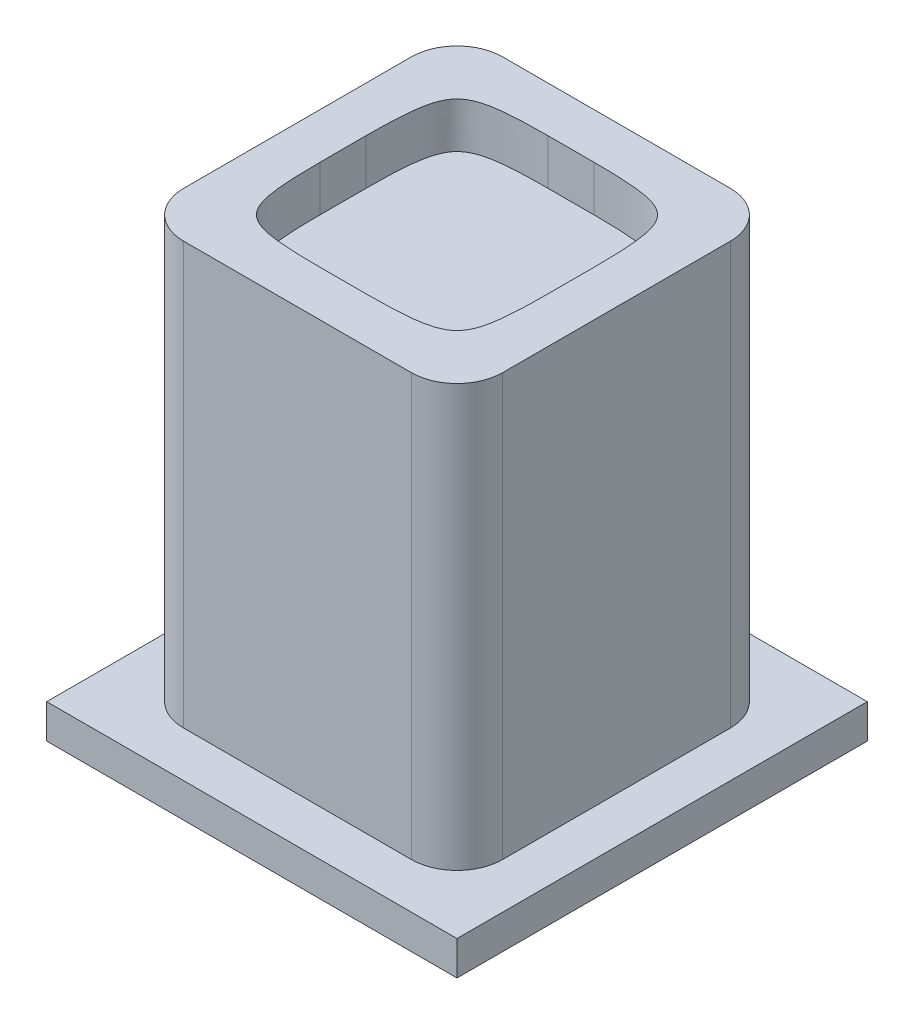
ISO-10303-21;
HEADER;
FILE_DESCRIPTION(('STEP AP214'),'2;1');
FILE_NAME('part.step','',(''),(''),'','','');
FILE_SCHEMA(('AUTOMOTIVE_DESIGN { 1 0 10303 214 1 1 1 1 }'));
ENDSEC;
DATA;
#1=APPLICATION_CONTEXT('core data for automotive mechanical design processes');
#2=APPLICATION_PROTOCOL_DEFINITION('international standard','automotive_design',2000,#1);
#3=PRODUCT_CONTEXT('',#1,'mechanical');
#4=PRODUCT('Part','Part','',(#3));
#5=PRODUCT_RELATED_PRODUCT_CATEGORY('part','',(#4));
#6=PRODUCT_DEFINITION_FORMATION('','',#4);
#7=PRODUCT_DEFINITION_CONTEXT('part definition',#1,'design');
#8=PRODUCT_DEFINITION('design','',#6,#7);
#9=PRODUCT_DEFINITION_SHAPE('','',#8);
#10=(LENGTH_UNIT() NAMED_UNIT(*) SI_UNIT(.MILLI.,.METRE.));
#11=(NAMED_UNIT(*) PLANE_ANGLE_UNIT() SI_UNIT($,.RADIAN.));
#12=(NAMED_UNIT(*) SI_UNIT($,.STERADIAN.) SOLID_ANGLE_UNIT());
#13=UNCERTAINTY_MEASURE_WITH_UNIT(LENGTH_MEASURE(1.E-05),#10,'distance_accuracy_value','');
#14=(GEOMETRIC_REPRESENTATION_CONTEXT(3) GLOBAL_UNCERTAINTY_ASSIGNED_CONTEXT((#13)) GLOBAL_UNIT_ASSIGNED_CONTEXT((#10,
#11,#12)) REPRESENTATION_CONTEXT('',''));
#15=CARTESIAN_POINT('',(0.,0.,0.));
#16=DIRECTION('',(0.,0.,1.));
#17=DIRECTION('',(1.,0.,0.));
#18=AXIS2_PLACEMENT_3D('',#15,#16,#17);
#19=CARTESIAN_POINT('',(0.,10.,-20.1661767732471));
#20=DIRECTION('',(0.,0.,-1.));
#21=DIRECTION('',(-1.,0.,0.));
#22=AXIS2_PLACEMENT_3D('',#19,#20,#21);
#23=PLANE('',#22);
#24=DIRECTION('',(1.,0.,0.));
#25=VECTOR('',#24,1.);
#26=CARTESIAN_POINT('',(-6.71300020580802,0.75,-20.1661767732471));
#27=LINE('',#26,#25);
#28=CARTESIAN_POINT('',(-12.713000205808,0.75,-20.1661767732471));
#29=VERTEX_POINT('',#28);
#30=CARTESIAN_POINT('',(-7.71300020580801,0.75,-20.1661767732471));
#31=VERTEX_POINT('',#30);
#32=EDGE_CURVE('E198',#29,#31,#27,.T.);
#33=ORIENTED_EDGE('',*,*,#32,.F.);
#34=DIRECTION('',(0.,-1.,0.));
#35=VECTOR('',#34,1.);
#36=CARTESIAN_POINT('',(-12.713000205808,10.,-20.1661767732471));
#37=LINE('',#36,#35);
#38=CARTESIAN_POINT('',(-12.713000205808,10.,-20.1661767732471));
#39=VERTEX_POINT('',#38);
#40=EDGE_CURVE('E706',#29,#39,#37,.F.);
#41=ORIENTED_EDGE('',*,*,#40,.T.);
#42=DIRECTION('',(1.,0.,0.));
#43=VECTOR('',#42,1.);
#44=CARTESIAN_POINT('',(0.,10.,-20.1661767732471));
#45=LINE('',#44,#43);
#46=CARTESIAN_POINT('',(-7.71300020580801,10.,-20.1661767732471));
#47=VERTEX_POINT('',#46);
#48=EDGE_CURVE('E244',#39,#47,#45,.T.);
#49=ORIENTED_EDGE('',*,*,#48,.T.);
#50=DIRECTION('',(0.,-1.,0.));
#51=VECTOR('',#50,1.);
#52=CARTESIAN_POINT('',(-7.71300020580801,10.,-20.1661767732471));
#53=LINE('',#52,#51);
#54=EDGE_CURVE('E718',#47,#31,#53,.T.);
#55=ORIENTED_EDGE('',*,*,#54,.T.);
#56=EDGE_LOOP('',(#33,#41,#49,#55));
#57=FACE_BOUND('',#56,.T.);
#58=ADVANCED_FACE('F41',(#57),#23,.T.);
#59=CARTESIAN_POINT('',(-13.713000205808,10.,0.));
#60=DIRECTION('',(1.,0.,0.));
#61=DIRECTION('',(0.,0.,-1.));
#62=AXIS2_PLACEMENT_3D('',#59,#60,#61);
#63=PLANE('',#62);
#64=DIRECTION('',(0.,0.,-1.));
#65=VECTOR('',#64,1.);
#66=CARTESIAN_POINT('',(-13.713000205808,0.75,-20.1661767732471));
#67=LINE('',#66,#65);
#68=CARTESIAN_POINT('',(-13.713000205808,0.75,-14.1661767732471));
#69=VERTEX_POINT('',#68);
#70=CARTESIAN_POINT('',(-13.713000205808,0.75,-19.1661767732471));
#71=VERTEX_POINT('',#70);
#72=EDGE_CURVE('E205',#69,#71,#67,.T.);
#73=ORIENTED_EDGE('',*,*,#72,.F.);
#74=DIRECTION('',(0.,-1.,0.));
#75=VECTOR('',#74,1.);
#76=CARTESIAN_POINT('',(-13.713000205808,10.,-14.1661767732471));
#77=LINE('',#76,#75);
#78=CARTESIAN_POINT('',(-13.713000205808,10.,-14.1661767732471));
#79=VERTEX_POINT('',#78);
#80=EDGE_CURVE('E730',#69,#79,#77,.F.);
#81=ORIENTED_EDGE('',*,*,#80,.T.);
#82=DIRECTION('',(0.,0.,1.));
#83=VECTOR('',#82,1.);
#84=CARTESIAN_POINT('',(-13.713000205808,10.,0.));
#85=LINE('',#84,#83);
#86=CARTESIAN_POINT('',(-13.713000205808,10.,-19.1661767732471));
#87=VERTEX_POINT('',#86);
#88=EDGE_CURVE('E247',#87,#79,#85,.T.);
#89=ORIENTED_EDGE('',*,*,#88,.F.);
#90=DIRECTION('',(0.,-1.,0.));
#91=VECTOR('',#90,1.);
#92=CARTESIAN_POINT('',(-13.713000205808,0.750000000000001,-19.1661767732471));
#93=LINE('',#92,#91);
#94=EDGE_CURVE('E732',#87,#71,#93,.T.);
#95=ORIENTED_EDGE('',*,*,#94,.T.);
#96=EDGE_LOOP('',(#73,#81,#89,#95));
#97=FACE_BOUND('',#96,.T.);
#98=ADVANCED_FACE('F676',(#97),#63,.F.);
#99=CARTESIAN_POINT('',(0.,10.,-13.1661767732471));
#100=DIRECTION('',(0.,0.,-1.));
#101=DIRECTION('',(-1.,0.,0.));
#102=AXIS2_PLACEMENT_3D('',#99,#100,#101);
#103=PLANE('',#102);
#104=DIRECTION('',(1.,0.,0.));
#105=VECTOR('',#104,1.);
#106=CARTESIAN_POINT('',(0.,10.,-13.1661767732471));
#107=LINE('',#106,#105);
#108=CARTESIAN_POINT('',(-12.713000205808,10.,-13.1661767732471));
#109=VERTEX_POINT('',#108);
#110=CARTESIAN_POINT('',(-7.71300020580801,10.,-13.1661767732471));
#111=VERTEX_POINT('',#110);
#112=EDGE_CURVE('E232',#109,#111,#107,.T.);
#113=ORIENTED_EDGE('',*,*,#112,.F.);
#114=DIRECTION('',(0.,-1.,0.));
#115=VECTOR('',#114,1.);
#116=CARTESIAN_POINT('',(-12.713000205808,10.,-13.1661767732471));
#117=LINE('',#116,#115);
#118=CARTESIAN_POINT('',(-12.713000205808,0.75,-13.166176773247));
#119=VERTEX_POINT('',#118);
#120=EDGE_CURVE('E733',#109,#119,#117,.T.);
#121=ORIENTED_EDGE('',*,*,#120,.T.);
#122=DIRECTION('',(-1.,0.,0.));
#123=VECTOR('',#122,1.);
#124=CARTESIAN_POINT('',(-13.713000205808,0.75,-13.166176773247));
#125=LINE('',#124,#123);
#126=CARTESIAN_POINT('',(-7.71300020580801,0.75,-13.1661767732471));
#127=VERTEX_POINT('',#126);
#128=EDGE_CURVE('E206',#127,#119,#125,.T.);
#129=ORIENTED_EDGE('',*,*,#128,.F.);
#130=DIRECTION('',(0.,-1.,0.));
#131=VECTOR('',#130,1.);
#132=CARTESIAN_POINT('',(-7.71300020580801,10.,-13.1661767732471));
#133=LINE('',#132,#131);
#134=EDGE_CURVE('E459',#127,#111,#133,.F.);
#135=ORIENTED_EDGE('',*,*,#134,.T.);
#136=EDGE_LOOP('',(#113,#121,#129,#135));
#137=FACE_BOUND('',#136,.T.);
#138=ADVANCED_FACE('F682',(#137),#103,.F.);
#139=CARTESIAN_POINT('',(-6.71300020580801,10.,0.));
#140=DIRECTION('',(1.,0.,0.));
#141=DIRECTION('',(0.,0.,-1.));
#142=AXIS2_PLACEMENT_3D('',#139,#140,#141);
#143=PLANE('',#142);
#144=DIRECTION('',(0.,0.,1.));
#145=VECTOR('',#144,1.);
#146=CARTESIAN_POINT('',(-6.71300020580801,0.75,-13.1661767732471));
#147=LINE('',#146,#145);
#148=CARTESIAN_POINT('',(-6.71300020580801,0.75,-19.1661767732471));
#149=VERTEX_POINT('',#148);
#150=CARTESIAN_POINT('',(-6.71300020580801,0.75,-14.1661767732471));
#151=VERTEX_POINT('',#150);
#152=EDGE_CURVE('E229',#149,#151,#147,.T.);
#153=ORIENTED_EDGE('',*,*,#152,.F.);
#154=DIRECTION('',(0.,-1.,0.));
#155=VECTOR('',#154,1.);
#156=CARTESIAN_POINT('',(-6.71300020580801,10.,-19.1661767732471));
#157=LINE('',#156,#155);
#158=CARTESIAN_POINT('',(-6.71300020580801,10.,-19.1661767732471));
#159=VERTEX_POINT('',#158);
#160=EDGE_CURVE('E693',#149,#159,#157,.F.);
#161=ORIENTED_EDGE('',*,*,#160,.T.);
#162=DIRECTION('',(0.,0.,1.));
#163=VECTOR('',#162,1.);
#164=CARTESIAN_POINT('',(-6.71300020580801,10.,0.));
#165=LINE('',#164,#163);
#166=CARTESIAN_POINT('',(-6.71300020580801,10.,-14.1661767732471));
#167=VERTEX_POINT('',#166);
#168=EDGE_CURVE('E239',#159,#167,#165,.T.);
#169=ORIENTED_EDGE('',*,*,#168,.T.);
#170=DIRECTION('',(0.,-1.,0.));
#171=VECTOR('',#170,1.);
#172=CARTESIAN_POINT('',(-6.71300020580801,0.750000000000001,-14.1661767732471));
#173=LINE('',#172,#171);
#174=EDGE_CURVE('E695',#167,#151,#173,.T.);
#175=ORIENTED_EDGE('',*,*,#174,.T.);
#176=EDGE_LOOP('',(#153,#161,#169,#175));
#177=FACE_BOUND('',#176,.T.);
#178=ADVANCED_FACE('F426',(#177),#143,.T.);
#179=CARTESIAN_POINT('',(0.,10.,0.));
#180=DIRECTION('',(0.,1.,0.));
#181=DIRECTION('',(0.,0.,1.));
#182=AXIS2_PLACEMENT_3D('',#179,#180,#181);
#183=PLANE('',#182);
#184=DIRECTION('',(0.,0.,-1.));
#185=VECTOR('',#184,1.);
#186=CARTESIAN_POINT('',(-7.71300020580801,10.,-14.1661767732471));
#187=LINE('',#186,#185);
#188=CARTESIAN_POINT('',(-7.71300020580801,10.,-16.1661767732471));
#189=VERTEX_POINT('',#188);
#190=CARTESIAN_POINT('',(-7.71300020580801,10.,-17.1661767732471));
#191=VERTEX_POINT('',#190);
#192=EDGE_CURVE('E270',#189,#191,#187,.T.);
#193=ORIENTED_EDGE('',*,*,#192,.F.);
#194=CARTESIAN_POINT('',(-9.71300020580801,10.,-14.1661767732471));
#195=CARTESIAN_POINT('',(-7.71300020580801,10.,-14.1661767732471));
#196=CARTESIAN_POINT('',(-7.71300020580801,10.,-16.1661767732471));
#197=(BOUNDED_CURVE() B_SPLINE_CURVE(2,(#194,#195,#196),.UNSPECIFIED.,.F.,
.F.) B_SPLINE_CURVE_WITH_KNOTS((3,3),(0.,1.),
.UNSPECIFIED.) CURVE() GEOMETRIC_REPRESENTATION_ITEM() RATIONAL_B_SPLINE_CURVE((1.,
2.33333333333334,1.)) REPRESENTATION_ITEM(''));
#198=CARTESIAN_POINT('',(-9.71300020580801,10.,-14.1661767732471));
#199=VERTEX_POINT('',#198);
#200=EDGE_CURVE('E455',#189,#199,#197,.F.);
#201=ORIENTED_EDGE('',*,*,#200,.T.);
#202=DIRECTION('',(1.,0.,0.));
#203=VECTOR('',#202,1.);
#204=CARTESIAN_POINT('',(-7.71300020580801,10.,-14.1661767732471));
#205=LINE('',#204,#203);
#206=CARTESIAN_POINT('',(-10.713000205808,10.,-14.1661767732471));
#207=VERTEX_POINT('',#206);
#208=EDGE_CURVE('E255',#207,#199,#205,.T.);
#209=ORIENTED_EDGE('',*,*,#208,.F.);
#210=CARTESIAN_POINT('',(-12.713000205808,10.,-16.1661767732471));
#211=CARTESIAN_POINT('',(-12.713000205808,10.,-14.1661767732471));
#212=CARTESIAN_POINT('',(-10.713000205808,10.,-14.1661767732471));
#213=(BOUNDED_CURVE() B_SPLINE_CURVE(2,(#210,#211,#212),.UNSPECIFIED.,.F.,
.F.) B_SPLINE_CURVE_WITH_KNOTS((3,3),(0.,1.),
.UNSPECIFIED.) CURVE() GEOMETRIC_REPRESENTATION_ITEM() RATIONAL_B_SPLINE_CURVE((1.,
2.33333333333334,1.)) REPRESENTATION_ITEM(''));
#214=CARTESIAN_POINT('',(-12.713000205808,10.,-16.1661767732471));
#215=VERTEX_POINT('',#214);
#216=EDGE_CURVE('E447',#207,#215,#213,.F.);
#217=ORIENTED_EDGE('',*,*,#216,.T.);
#218=DIRECTION('',(0.,0.,1.));
#219=VECTOR('',#218,1.);
#220=CARTESIAN_POINT('',(-12.713000205808,10.,-14.1661767732471));
#221=LINE('',#220,#219);
#222=CARTESIAN_POINT('',(-12.713000205808,10.,-17.1661767732471));
#223=VERTEX_POINT('',#222);
#224=EDGE_CURVE('E252',#223,#215,#221,.T.);
#225=ORIENTED_EDGE('',*,*,#224,.F.);
#226=CARTESIAN_POINT('',(-10.713000205808,10.,-19.1661767732471));
#227=CARTESIAN_POINT('',(-12.713000205808,10.,-19.1661767732471));
#228=CARTESIAN_POINT('',(-12.713000205808,10.,-17.1661767732471));
#229=(BOUNDED_CURVE() B_SPLINE_CURVE(2,(#226,#227,#228),.UNSPECIFIED.,.F.,
.F.) B_SPLINE_CURVE_WITH_KNOTS((3,3),(0.,1.),
.UNSPECIFIED.) CURVE() GEOMETRIC_REPRESENTATION_ITEM() RATIONAL_B_SPLINE_CURVE((1.,
2.33333333333334,1.)) REPRESENTATION_ITEM(''));
#230=CARTESIAN_POINT('',(-10.713000205808,10.,-19.1661767732471));
#231=VERTEX_POINT('',#230);
#232=EDGE_CURVE('E410',#223,#231,#229,.F.);
#233=ORIENTED_EDGE('',*,*,#232,.T.);
#234=DIRECTION('',(-1.,0.,0.));
#235=VECTOR('',#234,1.);
#236=CARTESIAN_POINT('',(-7.71300020580801,10.,-19.1661767732471));
#237=LINE('',#236,#235);
#238=CARTESIAN_POINT('',(-9.71300020580801,10.,-19.1661767732471));
#239=VERTEX_POINT('',#238);
#240=EDGE_CURVE('E256',#239,#231,#237,.T.);
#241=ORIENTED_EDGE('',*,*,#240,.F.);
#242=CARTESIAN_POINT('',(-7.71300020580802,10.,-17.1661767732471));
#243=CARTESIAN_POINT('',(-7.71300020580801,10.,-19.1661767732471));
#244=CARTESIAN_POINT('',(-9.71300020580801,10.,-19.1661767732471));
#245=(BOUNDED_CURVE() B_SPLINE_CURVE(2,(#242,#243,#244),.UNSPECIFIED.,.F.,
.F.) B_SPLINE_CURVE_WITH_KNOTS((3,3),(0.,1.),
.UNSPECIFIED.) CURVE() GEOMETRIC_REPRESENTATION_ITEM() RATIONAL_B_SPLINE_CURVE((1.,
2.33333333333334,1.)) REPRESENTATION_ITEM(''));
#246=EDGE_CURVE('E635',#239,#191,#245,.F.);
#247=ORIENTED_EDGE('',*,*,#246,.T.);
#248=EDGE_LOOP('',(#193,#201,#209,#217,#225,#233,#241,#247));
#249=FACE_BOUND('',#248,.T.);
#250=ORIENTED_EDGE('',*,*,#88,.T.);
#251=CARTESIAN_POINT('',(-12.713000205808,10.,-14.1661767732471));
#252=DIRECTION('',(0.,1.,0.));
#253=DIRECTION('',(0.,0.,1.));
#254=AXIS2_PLACEMENT_3D('',#251,#252,#253);
#255=CIRCLE('',#254,1.);
#256=EDGE_CURVE('E722',#79,#109,#255,.T.);
#257=ORIENTED_EDGE('',*,*,#256,.T.);
#258=ORIENTED_EDGE('',*,*,#112,.T.);
#259=CARTESIAN_POINT('',(-7.71300020580801,10.,-14.1661767732471));
#260=DIRECTION('',(0.,1.,0.));
#261=DIRECTION('',(0.,0.,1.));
#262=AXIS2_PLACEMENT_3D('',#259,#260,#261);
#263=CIRCLE('',#262,1.);
#264=EDGE_CURVE('E728',#111,#167,#263,.T.);
#265=ORIENTED_EDGE('',*,*,#264,.T.);
#266=ORIENTED_EDGE('',*,*,#168,.F.);
#267=CARTESIAN_POINT('',(-7.71300020580801,10.,-19.1661767732471));
#268=DIRECTION('',(0.,1.,0.));
#269=DIRECTION('',(0.,0.,1.));
#270=AXIS2_PLACEMENT_3D('',#267,#268,#269);
#271=CIRCLE('',#270,1.);
#272=EDGE_CURVE('E701',#159,#47,#271,.T.);
#273=ORIENTED_EDGE('',*,*,#272,.T.);
#274=ORIENTED_EDGE('',*,*,#48,.F.);
#275=CARTESIAN_POINT('',(-12.713000205808,10.,-19.1661767732471));
#276=DIRECTION('',(0.,1.,0.));
#277=DIRECTION('',(0.,0.,1.));
#278=AXIS2_PLACEMENT_3D('',#275,#276,#277);
#279=CIRCLE('',#278,1.);
#280=EDGE_CURVE('E721',#39,#87,#279,.T.);
#281=ORIENTED_EDGE('',*,*,#280,.T.);
#282=EDGE_LOOP('',(#250,#257,#258,#265,#266,#273,#274,#281));
#283=FACE_BOUND('',#282,.T.);
#284=ADVANCED_FACE('F416',(#249,#283),#183,.T.);
#285=CARTESIAN_POINT('',(0.,0.,0.));
#286=DIRECTION('',(0.,1.,0.));
#287=DIRECTION('',(0.,0.,1.));
#288=AXIS2_PLACEMENT_3D('',#285,#286,#287);
#289=PLANE('',#288);
#290=DIRECTION('',(0.,0.,-1.));
#291=VECTOR('',#290,1.);
#292=CARTESIAN_POINT('',(-5.71300020580801,0.,-13.1661767732471));
#293=LINE('',#292,#291);
#294=CARTESIAN_POINT('',(-5.71300020580797,0.,-12.1661767732471));
#295=VERTEX_POINT('',#294);
#296=CARTESIAN_POINT('',(-5.71300020580801,0.,-21.1661767732471));
#297=VERTEX_POINT('',#296);
#298=EDGE_CURVE('E177',#295,#297,#293,.T.);
#299=ORIENTED_EDGE('',*,*,#298,.F.);
#300=DIRECTION('',(1.,0.,0.));
#301=VECTOR('',#300,1.);
#302=CARTESIAN_POINT('',(-14.713000205808,0.,-12.1661767732471));
#303=LINE('',#302,#301);
#304=CARTESIAN_POINT('',(-14.713000205808,0.,-12.1661767732471));
#305=VERTEX_POINT('',#304);
#306=EDGE_CURVE('E182',#305,#295,#303,.T.);
#307=ORIENTED_EDGE('',*,*,#306,.F.);
#308=DIRECTION('',(0.,0.,1.));
#309=VECTOR('',#308,1.);
#310=CARTESIAN_POINT('',(-14.713000205808,0.,-21.1661767732471));
#311=LINE('',#310,#309);
#312=CARTESIAN_POINT('',(-14.713000205808,0.,-21.1661767732471));
#313=VERTEX_POINT('',#312);
#314=EDGE_CURVE('E189',#313,#305,#311,.T.);
#315=ORIENTED_EDGE('',*,*,#314,.F.);
#316=DIRECTION('',(-1.,0.,0.));
#317=VECTOR('',#316,1.);
#318=CARTESIAN_POINT('',(-5.71300020580801,0.,-21.1661767732471));
#319=LINE('',#318,#317);
#320=EDGE_CURVE('E184',#297,#313,#319,.T.);
#321=ORIENTED_EDGE('',*,*,#320,.F.);
#322=EDGE_LOOP('',(#299,#307,#315,#321));
#323=FACE_BOUND('',#322,.T.);
#324=CARTESIAN_POINT('',(-10.213000205808,0.,-16.6661767732471));
#325=DIRECTION('',(0.,1.,0.));
#326=DIRECTION('',(0.,0.,1.));
#327=AXIS2_PLACEMENT_3D('',#324,#325,#326);
#328=CIRCLE('',#327,1.8);
#329=CARTESIAN_POINT('',(-10.213000205808,0.,-14.8661767732471));
#330=VERTEX_POINT('',#329);
#331=EDGE_CURVE('E235',#330,#330,#328,.T.);
#332=ORIENTED_EDGE('',*,*,#331,.T.);
#333=EDGE_LOOP('',(#332));
#334=FACE_BOUND('',#333,.T.);
#335=ADVANCED_FACE('F179',(#323,#334),#289,.F.);
#336=CARTESIAN_POINT('',(-10.213000205808,0.75,-16.6661767732471));
#337=DIRECTION('',(0.,-1.,0.));
#338=DIRECTION('',(0.,0.,-1.));
#339=AXIS2_PLACEMENT_3D('',#336,#337,#338);
#340=CYLINDRICAL_SURFACE('',#339,1.8);
#341=CARTESIAN_POINT('',(-10.213000205808,0.75,-16.6661767732471));
#342=DIRECTION('',(0.,1.,0.));
#343=DIRECTION('',(0.,0.,1.));
#344=AXIS2_PLACEMENT_3D('',#341,#342,#343);
#345=CIRCLE('',#344,1.8);
#346=CARTESIAN_POINT('',(-10.213000205808,0.75,-14.8661767732471));
#347=VERTEX_POINT('',#346);
#348=EDGE_CURVE('E236',#347,#347,#345,.T.);
#349=ORIENTED_EDGE('',*,*,#348,.T.);
#350=EDGE_LOOP('',(#349));
#351=FACE_BOUND('',#350,.T.);
#352=ORIENTED_EDGE('',*,*,#331,.F.);
#353=EDGE_LOOP('',(#352));
#354=FACE_BOUND('',#353,.T.);
#355=ADVANCED_FACE('F427',(#351,#354),#340,.F.);
#356=CARTESIAN_POINT('',(0.,0.75,0.));
#357=DIRECTION('',(0.,1.,0.));
#358=DIRECTION('',(0.,0.,1.));
#359=AXIS2_PLACEMENT_3D('',#356,#357,#358);
#360=PLANE('',#359);
#361=ORIENTED_EDGE('',*,*,#348,.F.);
#362=EDGE_LOOP('',(#361));
#363=FACE_BOUND('',#362,.T.);
#364=ADVANCED_FACE('F845',(#363),#360,.F.);
#365=CARTESIAN_POINT('',(-5.71300020580801,0.,-21.1661767732471));
#366=DIRECTION('',(0.,0.,1.));
#367=DIRECTION('',(1.,0.,0.));
#368=AXIS2_PLACEMENT_3D('',#365,#366,#367);
#369=PLANE('',#368);
#370=ORIENTED_EDGE('',*,*,#320,.T.);
#371=DIRECTION('',(0.,1.,0.));
#372=VECTOR('',#371,1.);
#373=CARTESIAN_POINT('',(-14.713000205808,0.,-21.1661767732471));
#374=LINE('',#373,#372);
#375=CARTESIAN_POINT('',(-14.713000205808,0.75,-21.1661767732471));
#376=VERTEX_POINT('',#375);
#377=EDGE_CURVE('E219',#313,#376,#374,.T.);
#378=ORIENTED_EDGE('',*,*,#377,.T.);
#379=DIRECTION('',(-1.,0.,0.));
#380=VECTOR('',#379,1.);
#381=CARTESIAN_POINT('',(-5.71300020580801,0.75,-21.1661767732471));
#382=LINE('',#381,#380);
#383=CARTESIAN_POINT('',(-5.71300020580801,0.75,-21.1661767732471));
#384=VERTEX_POINT('',#383);
#385=EDGE_CURVE('E228',#384,#376,#382,.T.);
#386=ORIENTED_EDGE('',*,*,#385,.F.);
#387=DIRECTION('',(0.,1.,0.));
#388=VECTOR('',#387,1.);
#389=CARTESIAN_POINT('',(-5.71300020580801,0.,-21.1661767732471));
#390=LINE('',#389,#388);
#391=EDGE_CURVE('E188',#297,#384,#390,.T.);
#392=ORIENTED_EDGE('',*,*,#391,.F.);
#393=EDGE_LOOP('',(#370,#378,#386,#392));
#394=FACE_BOUND('',#393,.T.);
#395=ADVANCED_FACE('F840',(#394),#369,.F.);
#396=CARTESIAN_POINT('',(-5.71300020580801,0.75,-13.1661767732471));
#397=DIRECTION('',(0.,-1.,0.));
#398=DIRECTION('',(0.,0.,-1.));
#399=AXIS2_PLACEMENT_3D('',#396,#397,#398);
#400=PLANE('',#399);
#401=ORIENTED_EDGE('',*,*,#72,.T.);
#402=CARTESIAN_POINT('',(-12.713000205808,0.750000000000001,-19.1661767732471));
#403=DIRECTION('',(0.,-1.,0.));
#404=DIRECTION('',(0.,0.,-1.));
#405=AXIS2_PLACEMENT_3D('',#402,#403,#404);
#406=CIRCLE('',#405,1.);
#407=EDGE_CURVE('E704',#71,#29,#406,.T.);
#408=ORIENTED_EDGE('',*,*,#407,.T.);
#409=ORIENTED_EDGE('',*,*,#32,.T.);
#410=CARTESIAN_POINT('',(-7.71300020580801,0.750000000000001,-19.1661767732471));
#411=DIRECTION('',(0.,-1.,0.));
#412=DIRECTION('',(0.,0.,-1.));
#413=AXIS2_PLACEMENT_3D('',#410,#411,#412);
#414=CIRCLE('',#413,1.);
#415=EDGE_CURVE('E49',#31,#149,#414,.T.);
#416=ORIENTED_EDGE('',*,*,#415,.T.);
#417=ORIENTED_EDGE('',*,*,#152,.T.);
#418=CARTESIAN_POINT('',(-7.71300020580801,0.750000000000001,-14.1661767732471));
#419=DIRECTION('',(0.,-1.,0.));
#420=DIRECTION('',(0.,0.,-1.));
#421=AXIS2_PLACEMENT_3D('',#418,#419,#420);
#422=CIRCLE('',#421,1.);
#423=EDGE_CURVE('E12',#151,#127,#422,.T.);
#424=ORIENTED_EDGE('',*,*,#423,.T.);
#425=ORIENTED_EDGE('',*,*,#128,.T.);
#426=CARTESIAN_POINT('',(-12.713000205808,0.750000000000001,-14.1661767732471));
#427=DIRECTION('',(0.,-1.,0.));
#428=DIRECTION('',(0.,0.,-1.));
#429=AXIS2_PLACEMENT_3D('',#426,#427,#428);
#430=CIRCLE('',#429,1.);
#431=EDGE_CURVE('E702',#119,#69,#430,.T.);
#432=ORIENTED_EDGE('',*,*,#431,.T.);
#433=EDGE_LOOP('',(#401,#408,#409,#416,#417,#424,#425,#432));
#434=FACE_BOUND('',#433,.T.);
#435=ORIENTED_EDGE('',*,*,#385,.T.);
#436=DIRECTION('',(0.,0.,1.));
#437=VECTOR('',#436,1.);
#438=CARTESIAN_POINT('',(-14.713000205808,0.75,-21.1661767732471));
#439=LINE('',#438,#437);
#440=CARTESIAN_POINT('',(-14.713000205808,0.75,-12.1661767732471));
#441=VERTEX_POINT('',#440);
#442=EDGE_CURVE('E222',#376,#441,#439,.T.);
#443=ORIENTED_EDGE('',*,*,#442,.T.);
#444=DIRECTION('',(1.,0.,0.));
#445=VECTOR('',#444,1.);
#446=CARTESIAN_POINT('',(-14.713000205808,0.75,-12.1661767732471));
#447=LINE('',#446,#445);
#448=CARTESIAN_POINT('',(-5.71300020580797,0.75,-12.1661767732471));
#449=VERTEX_POINT('',#448);
#450=EDGE_CURVE('E199',#441,#449,#447,.T.);
#451=ORIENTED_EDGE('',*,*,#450,.T.);
#452=DIRECTION('',(0.,0.,1.));
#453=VECTOR('',#452,1.);
#454=CARTESIAN_POINT('',(-5.71300020580801,0.75,-13.1661767732471));
#455=LINE('',#454,#453);
#456=EDGE_CURVE('E203',#384,#449,#455,.T.);
#457=ORIENTED_EDGE('',*,*,#456,.F.);
#458=EDGE_LOOP('',(#435,#443,#451,#457));
#459=FACE_BOUND('',#458,.T.);
#460=ADVANCED_FACE('F710',(#434,#459),#400,.F.);
#461=CARTESIAN_POINT('',(-5.71300020580801,0.,0.));
#462=DIRECTION('',(-1.,0.,0.));
#463=DIRECTION('',(0.,0.,1.));
#464=AXIS2_PLACEMENT_3D('',#461,#462,#463);
#465=PLANE('',#464);
#466=ORIENTED_EDGE('',*,*,#456,.T.);
#467=DIRECTION('',(0.,1.,0.));
#468=VECTOR('',#467,1.);
#469=CARTESIAN_POINT('',(-5.71300020580797,0.,-12.1661767732471));
#470=LINE('',#469,#468);
#471=EDGE_CURVE('E195',#295,#449,#470,.T.);
#472=ORIENTED_EDGE('',*,*,#471,.F.);
#473=ORIENTED_EDGE('',*,*,#298,.T.);
#474=ORIENTED_EDGE('',*,*,#391,.T.);
#475=EDGE_LOOP('',(#466,#472,#473,#474));
#476=FACE_BOUND('',#475,.T.);
#477=ADVANCED_FACE('F201',(#476),#465,.F.);
#478=CARTESIAN_POINT('',(-14.713000205808,0.,-21.1661767732471));
#479=DIRECTION('',(1.,0.,0.));
#480=DIRECTION('',(0.,0.,-1.));
#481=AXIS2_PLACEMENT_3D('',#478,#479,#480);
#482=PLANE('',#481);
#483=ORIENTED_EDGE('',*,*,#314,.T.);
#484=DIRECTION('',(0.,1.,0.));
#485=VECTOR('',#484,1.);
#486=CARTESIAN_POINT('',(-14.713000205808,0.,-12.1661767732471));
#487=LINE('',#486,#485);
#488=EDGE_CURVE('E197',#305,#441,#487,.T.);
#489=ORIENTED_EDGE('',*,*,#488,.T.);
#490=ORIENTED_EDGE('',*,*,#442,.F.);
#491=ORIENTED_EDGE('',*,*,#377,.F.);
#492=EDGE_LOOP('',(#483,#489,#490,#491));
#493=FACE_BOUND('',#492,.T.);
#494=ADVANCED_FACE('F815',(#493),#482,.F.);
#495=CARTESIAN_POINT('',(-14.713000205808,0.,-12.1661767732471));
#496=DIRECTION('',(0.,0.,-1.));
#497=DIRECTION('',(-1.,0.,0.));
#498=AXIS2_PLACEMENT_3D('',#495,#496,#497);
#499=PLANE('',#498);
#500=ORIENTED_EDGE('',*,*,#306,.T.);
#501=ORIENTED_EDGE('',*,*,#471,.T.);
#502=ORIENTED_EDGE('',*,*,#450,.F.);
#503=ORIENTED_EDGE('',*,*,#488,.F.);
#504=EDGE_LOOP('',(#500,#501,#502,#503));
#505=FACE_BOUND('',#504,.T.);
#506=ADVANCED_FACE('F193',(#505),#499,.F.);
#507=CARTESIAN_POINT('',(-7.71300020580801,9.,-14.1661767732471));
#508=DIRECTION('',(1.,0.,0.));
#509=DIRECTION('',(0.,0.,-1.));
#510=AXIS2_PLACEMENT_3D('',#507,#508,#509);
#511=PLANE('',#510);
#512=ORIENTED_EDGE('',*,*,#192,.T.);
#513=CARTESIAN_POINT('',(-7.71300020580801,8.95,-17.1661767732471));
#514=CARTESIAN_POINT('',(-7.71300020580801,9.31666666666667,-17.1661767732471));
#515=CARTESIAN_POINT('',(-7.71300020580801,9.68333333333333,-17.1661767732471));
#516=CARTESIAN_POINT('',(-7.71300020580801,10.05,-17.1661767732471));
#517=(BOUNDED_CURVE() B_SPLINE_CURVE(3,(#513,#514,#515,#516),.UNSPECIFIED.,.F.,
.F.) B_SPLINE_CURVE_WITH_KNOTS((4,4),(-0.00105,4.99999999999999E-05),
.UNSPECIFIED.) CURVE() GEOMETRIC_REPRESENTATION_ITEM() RATIONAL_B_SPLINE_CURVE((1.,1.,1.,1.)) REPRESENTATION_ITEM(''));
#518=CARTESIAN_POINT('',(-7.71300020580801,9.,-17.1661767732471));
#519=VERTEX_POINT('',#518);
#520=EDGE_CURVE('E463',#191,#519,#517,.F.);
#521=ORIENTED_EDGE('',*,*,#520,.T.);
#522=DIRECTION('',(0.,0.,-1.));
#523=VECTOR('',#522,1.);
#524=CARTESIAN_POINT('',(-7.71300020580801,9.,-14.1661767732471));
#525=LINE('',#524,#523);
#526=CARTESIAN_POINT('',(-7.71300020580801,9.,-16.1661767732471));
#527=VERTEX_POINT('',#526);
#528=EDGE_CURVE('E279',#527,#519,#525,.T.);
#529=ORIENTED_EDGE('',*,*,#528,.F.);
#530=CARTESIAN_POINT('',(-7.71300020580801,10.05,-16.1661767732471));
#531=CARTESIAN_POINT('',(-7.71300020580801,9.68333333333333,-16.1661767732471));
#532=CARTESIAN_POINT('',(-7.71300020580801,9.31666666666667,-16.1661767732471));
#533=CARTESIAN_POINT('',(-7.71300020580801,8.95,-16.1661767732471));
#534=(BOUNDED_CURVE() B_SPLINE_CURVE(3,(#530,#531,#532,#533),.UNSPECIFIED.,.F.,
.F.) B_SPLINE_CURVE_WITH_KNOTS((4,4),(-0.00105,5.E-05),
.UNSPECIFIED.) CURVE() GEOMETRIC_REPRESENTATION_ITEM() RATIONAL_B_SPLINE_CURVE((1.,1.,1.,1.)) REPRESENTATION_ITEM(''));
#535=EDGE_CURVE('E350',#527,#189,#534,.F.);
#536=ORIENTED_EDGE('',*,*,#535,.T.);
#537=EDGE_LOOP('',(#512,#521,#529,#536));
#538=FACE_BOUND('',#537,.T.);
#539=ADVANCED_FACE('F357',(#538),#511,.F.);
#540=CARTESIAN_POINT('',(-7.71300020580801,9.,-14.1661767732471));
#541=DIRECTION('',(0.,0.,1.));
#542=DIRECTION('',(1.,0.,0.));
#543=AXIS2_PLACEMENT_3D('',#540,#541,#542);
#544=PLANE('',#543);
#545=DIRECTION('',(1.,0.,0.));
#546=VECTOR('',#545,1.);
#547=CARTESIAN_POINT('',(-7.71300020580801,9.,-14.1661767732471));
#548=LINE('',#547,#546);
#549=CARTESIAN_POINT('',(-10.713000205808,9.,-14.1661767732471));
#550=VERTEX_POINT('',#549);
#551=CARTESIAN_POINT('',(-9.71300020580801,9.,-14.1661767732471));
#552=VERTEX_POINT('',#551);
#553=EDGE_CURVE('E211',#550,#552,#548,.T.);
#554=ORIENTED_EDGE('',*,*,#553,.F.);
#555=CARTESIAN_POINT('',(-10.713000205808,10.05,-14.1661767732471));
#556=CARTESIAN_POINT('',(-10.713000205808,9.68333333333333,-14.1661767732471));
#557=CARTESIAN_POINT('',(-10.713000205808,9.31666666666667,-14.1661767732471));
#558=CARTESIAN_POINT('',(-10.713000205808,8.95,-14.1661767732471));
#559=(BOUNDED_CURVE() B_SPLINE_CURVE(3,(#555,#556,#557,#558),.UNSPECIFIED.,.F.,
.F.) B_SPLINE_CURVE_WITH_KNOTS((4,4),(-0.00105,5.E-05),
.UNSPECIFIED.) CURVE() GEOMETRIC_REPRESENTATION_ITEM() RATIONAL_B_SPLINE_CURVE((1.,1.,1.,1.)) REPRESENTATION_ITEM(''));
#560=EDGE_CURVE('E396',#550,#207,#559,.F.);
#561=ORIENTED_EDGE('',*,*,#560,.T.);
#562=ORIENTED_EDGE('',*,*,#208,.T.);
#563=CARTESIAN_POINT('',(-9.71300020580801,8.95,-14.1661767732471));
#564=CARTESIAN_POINT('',(-9.71300020580801,9.31666666666667,-14.1661767732471));
#565=CARTESIAN_POINT('',(-9.71300020580801,9.68333333333333,-14.1661767732471));
#566=CARTESIAN_POINT('',(-9.71300020580801,10.05,-14.1661767732471));
#567=(BOUNDED_CURVE() B_SPLINE_CURVE(3,(#563,#564,#565,#566),.UNSPECIFIED.,.F.,
.F.) B_SPLINE_CURVE_WITH_KNOTS((4,4),(-0.00105,4.99999999999999E-05),
.UNSPECIFIED.) CURVE() GEOMETRIC_REPRESENTATION_ITEM() RATIONAL_B_SPLINE_CURVE((1.,1.,1.,1.)) REPRESENTATION_ITEM(''));
#568=EDGE_CURVE('E384',#199,#552,#567,.F.);
#569=ORIENTED_EDGE('',*,*,#568,.T.);
#570=EDGE_LOOP('',(#554,#561,#562,#569));
#571=FACE_BOUND('',#570,.T.);
#572=ADVANCED_FACE('F314',(#571),#544,.F.);
#573=CARTESIAN_POINT('',(-12.713000205808,9.,-14.1661767732471));
#574=DIRECTION('',(-1.,0.,0.));
#575=DIRECTION('',(0.,0.,1.));
#576=AXIS2_PLACEMENT_3D('',#573,#574,#575);
#577=PLANE('',#576);
#578=DIRECTION('',(0.,0.,1.));
#579=VECTOR('',#578,1.);
#580=CARTESIAN_POINT('',(-12.713000205808,9.,-14.1661767732471));
#581=LINE('',#580,#579);
#582=CARTESIAN_POINT('',(-12.713000205808,9.,-17.1661767732471));
#583=VERTEX_POINT('',#582);
#584=CARTESIAN_POINT('',(-12.713000205808,9.,-16.1661767732471));
#585=VERTEX_POINT('',#584);
#586=EDGE_CURVE('E257',#583,#585,#581,.T.);
#587=ORIENTED_EDGE('',*,*,#586,.F.);
#588=CARTESIAN_POINT('',(-12.713000205808,10.05,-17.1661767732471));
#589=CARTESIAN_POINT('',(-12.713000205808,9.68333333333333,-17.1661767732471));
#590=CARTESIAN_POINT('',(-12.713000205808,9.31666666666667,-17.1661767732471));
#591=CARTESIAN_POINT('',(-12.713000205808,8.95,-17.1661767732471));
#592=(BOUNDED_CURVE() B_SPLINE_CURVE(3,(#588,#589,#590,#591),.UNSPECIFIED.,.F.,
.F.) B_SPLINE_CURVE_WITH_KNOTS((4,4),(-0.00105,5.E-05),
.UNSPECIFIED.) CURVE() GEOMETRIC_REPRESENTATION_ITEM() RATIONAL_B_SPLINE_CURVE((1.,1.,1.,1.)) REPRESENTATION_ITEM(''));
#593=EDGE_CURVE('E540',#583,#223,#592,.F.);
#594=ORIENTED_EDGE('',*,*,#593,.T.);
#595=ORIENTED_EDGE('',*,*,#224,.T.);
#596=CARTESIAN_POINT('',(-12.713000205808,8.95,-16.1661767732471));
#597=CARTESIAN_POINT('',(-12.713000205808,9.31666666666667,-16.1661767732471));
#598=CARTESIAN_POINT('',(-12.713000205808,9.68333333333333,-16.1661767732471));
#599=CARTESIAN_POINT('',(-12.713000205808,10.05,-16.1661767732471));
#600=(BOUNDED_CURVE() B_SPLINE_CURVE(3,(#596,#597,#598,#599),.UNSPECIFIED.,.F.,
.F.) B_SPLINE_CURVE_WITH_KNOTS((4,4),(-0.00105,4.99999999999999E-05),
.UNSPECIFIED.) CURVE() GEOMETRIC_REPRESENTATION_ITEM() RATIONAL_B_SPLINE_CURVE((1.,1.,1.,1.)) REPRESENTATION_ITEM(''));
#601=EDGE_CURVE('E231',#215,#585,#600,.F.);
#602=ORIENTED_EDGE('',*,*,#601,.T.);
#603=EDGE_LOOP('',(#587,#594,#595,#602));
#604=FACE_BOUND('',#603,.T.);
#605=ADVANCED_FACE('F546',(#604),#577,.F.);
#606=CARTESIAN_POINT('',(-7.71300020580801,9.,-19.1661767732471));
#607=DIRECTION('',(0.,0.,-1.));
#608=DIRECTION('',(-1.,0.,0.));
#609=AXIS2_PLACEMENT_3D('',#606,#607,#608);
#610=PLANE('',#609);
#611=ORIENTED_EDGE('',*,*,#240,.T.);
#612=CARTESIAN_POINT('',(-10.713000205808,8.95,-19.1661767732471));
#613=CARTESIAN_POINT('',(-10.713000205808,9.31666666666667,-19.1661767732471));
#614=CARTESIAN_POINT('',(-10.713000205808,9.68333333333333,-19.1661767732471));
#615=CARTESIAN_POINT('',(-10.713000205808,10.05,-19.1661767732471));
#616=(BOUNDED_CURVE() B_SPLINE_CURVE(3,(#612,#613,#614,#615),.UNSPECIFIED.,.F.,
.F.) B_SPLINE_CURVE_WITH_KNOTS((4,4),(-0.00105,4.99999999999999E-05),
.UNSPECIFIED.) CURVE() GEOMETRIC_REPRESENTATION_ITEM() RATIONAL_B_SPLINE_CURVE((1.,1.,1.,1.)) REPRESENTATION_ITEM(''));
#617=CARTESIAN_POINT('',(-10.713000205808,9.,-19.1661767732471));
#618=VERTEX_POINT('',#617);
#619=EDGE_CURVE('E535',#231,#618,#616,.F.);
#620=ORIENTED_EDGE('',*,*,#619,.T.);
#621=DIRECTION('',(-1.,0.,0.));
#622=VECTOR('',#621,1.);
#623=CARTESIAN_POINT('',(-7.71300020580801,9.,-19.1661767732471));
#624=LINE('',#623,#622);
#625=CARTESIAN_POINT('',(-9.71300020580801,9.,-19.1661767732471));
#626=VERTEX_POINT('',#625);
#627=EDGE_CURVE('E275',#626,#618,#624,.T.);
#628=ORIENTED_EDGE('',*,*,#627,.F.);
#629=CARTESIAN_POINT('',(-9.71300020580801,10.05,-19.1661767732471));
#630=CARTESIAN_POINT('',(-9.71300020580801,9.68333333333333,-19.1661767732471));
#631=CARTESIAN_POINT('',(-9.71300020580801,9.31666666666667,-19.1661767732471));
#632=CARTESIAN_POINT('',(-9.71300020580801,8.95,-19.1661767732471));
#633=(BOUNDED_CURVE() B_SPLINE_CURVE(3,(#629,#630,#631,#632),.UNSPECIFIED.,.F.,
.F.) B_SPLINE_CURVE_WITH_KNOTS((4,4),(-0.00105,5.E-05),
.UNSPECIFIED.) CURVE() GEOMETRIC_REPRESENTATION_ITEM() RATIONAL_B_SPLINE_CURVE((1.,1.,1.,1.)) REPRESENTATION_ITEM(''));
#634=EDGE_CURVE('E536',#626,#239,#633,.F.);
#635=ORIENTED_EDGE('',*,*,#634,.T.);
#636=EDGE_LOOP('',(#611,#620,#628,#635));
#637=FACE_BOUND('',#636,.T.);
#638=ADVANCED_FACE('F313',(#637),#610,.F.);
#639=CARTESIAN_POINT('',(0.,9.,0.));
#640=DIRECTION('',(0.,1.,0.));
#641=DIRECTION('',(0.,0.,1.));
#642=AXIS2_PLACEMENT_3D('',#639,#640,#641);
#643=PLANE('',#642);
#644=ORIENTED_EDGE('',*,*,#627,.T.);
#645=CARTESIAN_POINT('',(-12.713000205808,9.,-17.1661767732471));
#646=CARTESIAN_POINT('',(-12.713000205808,9.,-19.1661767732471));
#647=CARTESIAN_POINT('',(-10.713000205808,9.,-19.1661767732471));
#648=(BOUNDED_CURVE() B_SPLINE_CURVE(2,(#645,#646,#647),.UNSPECIFIED.,.F.,
.F.) B_SPLINE_CURVE_WITH_KNOTS((3,3),(0.,1.),
.UNSPECIFIED.) CURVE() GEOMETRIC_REPRESENTATION_ITEM() RATIONAL_B_SPLINE_CURVE((1.,
2.33333333333334,1.)) REPRESENTATION_ITEM(''));
#649=EDGE_CURVE('E334',#618,#583,#648,.F.);
#650=ORIENTED_EDGE('',*,*,#649,.T.);
#651=ORIENTED_EDGE('',*,*,#586,.T.);
#652=CARTESIAN_POINT('',(-10.713000205808,9.,-14.1661767732471));
#653=CARTESIAN_POINT('',(-12.713000205808,9.,-14.1661767732471));
#654=CARTESIAN_POINT('',(-12.713000205808,9.,-16.1661767732471));
#655=(BOUNDED_CURVE() B_SPLINE_CURVE(2,(#652,#653,#654),.UNSPECIFIED.,.F.,
.F.) B_SPLINE_CURVE_WITH_KNOTS((3,3),(0.,1.),
.UNSPECIFIED.) CURVE() GEOMETRIC_REPRESENTATION_ITEM() RATIONAL_B_SPLINE_CURVE((1.,
2.33333333333334,1.)) REPRESENTATION_ITEM(''));
#656=EDGE_CURVE('E531',#585,#550,#655,.F.);
#657=ORIENTED_EDGE('',*,*,#656,.T.);
#658=ORIENTED_EDGE('',*,*,#553,.T.);
#659=CARTESIAN_POINT('',(-7.71300020580801,9.,-16.1661767732471));
#660=CARTESIAN_POINT('',(-7.71300020580801,9.,-14.1661767732471));
#661=CARTESIAN_POINT('',(-9.71300020580801,9.,-14.1661767732471));
#662=(BOUNDED_CURVE() B_SPLINE_CURVE(2,(#659,#660,#661),.UNSPECIFIED.,.F.,
.F.) B_SPLINE_CURVE_WITH_KNOTS((3,3),(0.,1.),
.UNSPECIFIED.) CURVE() GEOMETRIC_REPRESENTATION_ITEM() RATIONAL_B_SPLINE_CURVE((1.,
2.33333333333334,1.)) REPRESENTATION_ITEM(''));
#663=EDGE_CURVE('E296',#552,#527,#662,.F.);
#664=ORIENTED_EDGE('',*,*,#663,.T.);
#665=ORIENTED_EDGE('',*,*,#528,.T.);
#666=CARTESIAN_POINT('',(-9.71300020580801,9.,-19.1661767732471));
#667=CARTESIAN_POINT('',(-7.71300020580801,9.,-19.1661767732471));
#668=CARTESIAN_POINT('',(-7.71300020580801,9.,-17.1661767732471));
#669=(BOUNDED_CURVE() B_SPLINE_CURVE(2,(#666,#667,#668),.UNSPECIFIED.,.F.,
.F.) B_SPLINE_CURVE_WITH_KNOTS((3,3),(0.,1.),
.UNSPECIFIED.) CURVE() GEOMETRIC_REPRESENTATION_ITEM() RATIONAL_B_SPLINE_CURVE((1.,
2.33333333333334,1.)) REPRESENTATION_ITEM(''));
#670=EDGE_CURVE('E530',#519,#626,#669,.F.);
#671=ORIENTED_EDGE('',*,*,#670,.T.);
#672=EDGE_LOOP('',(#644,#650,#651,#657,#658,#664,#665,#671));
#673=FACE_BOUND('',#672,.T.);
#674=ADVANCED_FACE('F303',(#673),#643,.T.);
#675=CARTESIAN_POINT('',(-10.713000205808,10.05,-19.1661767732471));
#676=CARTESIAN_POINT('',(-10.713000205808,9.68333333333333,-19.1661767732471));
#677=CARTESIAN_POINT('',(-10.713000205808,9.31666666666667,-19.1661767732471));
#678=CARTESIAN_POINT('',(-10.713000205808,8.95,-19.1661767732471));
#679=CARTESIAN_POINT('',(-12.713000205808,10.05,-19.1661767732471));
#680=CARTESIAN_POINT('',(-12.713000205808,9.68333333333333,-19.1661767732471));
#681=CARTESIAN_POINT('',(-12.713000205808,9.31666666666667,-19.1661767732471));
#682=CARTESIAN_POINT('',(-12.713000205808,8.95,-19.1661767732471));
#683=CARTESIAN_POINT('',(-12.713000205808,10.05,-17.1661767732471));
#684=CARTESIAN_POINT('',(-12.713000205808,9.68333333333333,-17.1661767732471));
#685=CARTESIAN_POINT('',(-12.713000205808,9.31666666666667,-17.1661767732471));
#686=CARTESIAN_POINT('',(-12.713000205808,8.95,-17.1661767732471));
#687=(BOUNDED_SURFACE() B_SPLINE_SURFACE(2,3,((#675,#676,#677,#678),(#679,#680,#681,#682),(#683,
#684,#685,#686)),.UNSPECIFIED.,.F.,.F.,.F.) B_SPLINE_SURFACE_WITH_KNOTS((3,3),(4,4),(0.,1.),
(-0.00105,5.E-05),.UNSPECIFIED.) GEOMETRIC_REPRESENTATION_ITEM() RATIONAL_B_SPLINE_SURFACE(((1.,
1.,1.,1.),(2.33333333333334,2.33333333333334,2.33333333333334,2.33333333333334),(1.,1.,1.,1.))) REPRESENTATION_ITEM('') SURFACE());
#688=ORIENTED_EDGE('',*,*,#649,.F.);
#689=ORIENTED_EDGE('',*,*,#619,.F.);
#690=ORIENTED_EDGE('',*,*,#232,.F.);
#691=ORIENTED_EDGE('',*,*,#593,.F.);
#692=EDGE_LOOP('',(#688,#689,#690,#691));
#693=FACE_BOUND('',#692,.T.);
#694=ADVANCED_FACE('F312',(#693),#687,.T.);
#695=CARTESIAN_POINT('',(-7.71300020580801,10.05,-17.1661767732471));
#696=CARTESIAN_POINT('',(-7.71300020580801,9.68333333333333,-17.1661767732471));
#697=CARTESIAN_POINT('',(-7.71300020580801,9.31666666666667,-17.1661767732471));
#698=CARTESIAN_POINT('',(-7.71300020580801,8.95,-17.1661767732471));
#699=CARTESIAN_POINT('',(-7.71300020580801,10.05,-19.1661767732471));
#700=CARTESIAN_POINT('',(-7.71300020580801,9.68333333333333,-19.1661767732471));
#701=CARTESIAN_POINT('',(-7.71300020580801,9.31666666666667,-19.1661767732471));
#702=CARTESIAN_POINT('',(-7.71300020580801,8.95,-19.1661767732471));
#703=CARTESIAN_POINT('',(-9.71300020580801,10.05,-19.1661767732471));
#704=CARTESIAN_POINT('',(-9.71300020580801,9.68333333333333,-19.1661767732471));
#705=CARTESIAN_POINT('',(-9.71300020580801,9.31666666666667,-19.1661767732471));
#706=CARTESIAN_POINT('',(-9.71300020580801,8.95,-19.1661767732471));
#707=(BOUNDED_SURFACE() B_SPLINE_SURFACE(2,3,((#695,#696,#697,#698),(#699,#700,#701,#702),(#703,
#704,#705,#706)),.UNSPECIFIED.,.F.,.F.,.F.) B_SPLINE_SURFACE_WITH_KNOTS((3,3),(4,4),(0.,1.),
(-0.00105,5.E-05),.UNSPECIFIED.) GEOMETRIC_REPRESENTATION_ITEM() RATIONAL_B_SPLINE_SURFACE(((1.,
1.,1.,1.),(2.33333333333334,2.33333333333334,2.33333333333334,2.33333333333334),(1.,1.,1.,1.))) REPRESENTATION_ITEM('') SURFACE());
#708=ORIENTED_EDGE('',*,*,#670,.F.);
#709=ORIENTED_EDGE('',*,*,#520,.F.);
#710=ORIENTED_EDGE('',*,*,#246,.F.);
#711=ORIENTED_EDGE('',*,*,#634,.F.);
#712=EDGE_LOOP('',(#708,#709,#710,#711));
#713=FACE_BOUND('',#712,.T.);
#714=ADVANCED_FACE('F592',(#713),#707,.T.);
#715=CARTESIAN_POINT('',(-12.713000205808,10.05,-16.1661767732471));
#716=CARTESIAN_POINT('',(-12.713000205808,9.68333333333333,-16.1661767732471));
#717=CARTESIAN_POINT('',(-12.713000205808,9.31666666666667,-16.1661767732471));
#718=CARTESIAN_POINT('',(-12.713000205808,8.95,-16.1661767732471));
#719=CARTESIAN_POINT('',(-12.713000205808,10.05,-14.1661767732471));
#720=CARTESIAN_POINT('',(-12.713000205808,9.68333333333333,-14.1661767732471));
#721=CARTESIAN_POINT('',(-12.713000205808,9.31666666666667,-14.1661767732471));
#722=CARTESIAN_POINT('',(-12.713000205808,8.95,-14.1661767732471));
#723=CARTESIAN_POINT('',(-10.713000205808,10.05,-14.1661767732471));
#724=CARTESIAN_POINT('',(-10.713000205808,9.68333333333333,-14.1661767732471));
#725=CARTESIAN_POINT('',(-10.713000205808,9.31666666666667,-14.1661767732471));
#726=CARTESIAN_POINT('',(-10.713000205808,8.95,-14.1661767732471));
#727=(BOUNDED_SURFACE() B_SPLINE_SURFACE(2,3,((#715,#716,#717,#718),(#719,#720,#721,#722),(#723,
#724,#725,#726)),.UNSPECIFIED.,.F.,.F.,.F.) B_SPLINE_SURFACE_WITH_KNOTS((3,3),(4,4),(0.,1.),
(-0.00105,5.E-05),.UNSPECIFIED.) GEOMETRIC_REPRESENTATION_ITEM() RATIONAL_B_SPLINE_SURFACE(((1.,
1.,1.,1.),(2.33333333333334,2.33333333333334,2.33333333333334,2.33333333333334),(1.,1.,1.,1.))) REPRESENTATION_ITEM('') SURFACE());
#728=ORIENTED_EDGE('',*,*,#656,.F.);
#729=ORIENTED_EDGE('',*,*,#601,.F.);
#730=ORIENTED_EDGE('',*,*,#216,.F.);
#731=ORIENTED_EDGE('',*,*,#560,.F.);
#732=EDGE_LOOP('',(#728,#729,#730,#731));
#733=FACE_BOUND('',#732,.T.);
#734=ADVANCED_FACE('F488',(#733),#727,.T.);
#735=CARTESIAN_POINT('',(-9.71300020580801,10.05,-14.1661767732471));
#736=CARTESIAN_POINT('',(-9.71300020580801,9.68333333333333,-14.1661767732471));
#737=CARTESIAN_POINT('',(-9.71300020580801,9.31666666666667,-14.1661767732471));
#738=CARTESIAN_POINT('',(-9.71300020580801,8.95,-14.1661767732471));
#739=CARTESIAN_POINT('',(-7.71300020580801,10.05,-14.1661767732471));
#740=CARTESIAN_POINT('',(-7.71300020580801,9.68333333333333,-14.1661767732471));
#741=CARTESIAN_POINT('',(-7.71300020580801,9.31666666666667,-14.1661767732471));
#742=CARTESIAN_POINT('',(-7.71300020580801,8.95,-14.1661767732471));
#743=CARTESIAN_POINT('',(-7.71300020580801,10.05,-16.1661767732471));
#744=CARTESIAN_POINT('',(-7.71300020580801,9.68333333333333,-16.1661767732471));
#745=CARTESIAN_POINT('',(-7.71300020580801,9.31666666666667,-16.1661767732471));
#746=CARTESIAN_POINT('',(-7.71300020580801,8.95,-16.1661767732471));
#747=(BOUNDED_SURFACE() B_SPLINE_SURFACE(2,3,((#735,#736,#737,#738),(#739,#740,#741,#742),(#743,
#744,#745,#746)),.UNSPECIFIED.,.F.,.F.,.F.) B_SPLINE_SURFACE_WITH_KNOTS((3,3),(4,4),(0.,1.),
(-0.00105,5.E-05),.UNSPECIFIED.) GEOMETRIC_REPRESENTATION_ITEM() RATIONAL_B_SPLINE_SURFACE(((1.,
1.,1.,1.),(2.33333333333334,2.33333333333334,2.33333333333334,2.33333333333334),(1.,1.,1.,1.))) REPRESENTATION_ITEM('') SURFACE());
#748=ORIENTED_EDGE('',*,*,#663,.F.);
#749=ORIENTED_EDGE('',*,*,#568,.F.);
#750=ORIENTED_EDGE('',*,*,#200,.F.);
#751=ORIENTED_EDGE('',*,*,#535,.F.);
#752=EDGE_LOOP('',(#748,#749,#750,#751));
#753=FACE_BOUND('',#752,.T.);
#754=ADVANCED_FACE('F461',(#753),#747,.T.);
#755=CARTESIAN_POINT('',(-12.713000205808,10.,-14.1661767732471));
#756=DIRECTION('',(0.,-1.,0.));
#757=DIRECTION('',(0.,0.,-1.));
#758=AXIS2_PLACEMENT_3D('',#755,#756,#757);
#759=CYLINDRICAL_SURFACE('',#758,1.);
#760=ORIENTED_EDGE('',*,*,#256,.F.);
#761=ORIENTED_EDGE('',*,*,#80,.F.);
#762=ORIENTED_EDGE('',*,*,#431,.F.);
#763=ORIENTED_EDGE('',*,*,#120,.F.);
#764=EDGE_LOOP('',(#760,#761,#762,#763));
#765=FACE_BOUND('',#764,.T.);
#766=ADVANCED_FACE('F487',(#765),#759,.T.);
#767=CARTESIAN_POINT('',(-12.713000205808,10.,-19.1661767732471));
#768=DIRECTION('',(0.,1.,0.));
#769=DIRECTION('',(0.,0.,1.));
#770=AXIS2_PLACEMENT_3D('',#767,#768,#769);
#771=CYLINDRICAL_SURFACE('',#770,1.);
#772=ORIENTED_EDGE('',*,*,#280,.F.);
#773=ORIENTED_EDGE('',*,*,#40,.F.);
#774=ORIENTED_EDGE('',*,*,#407,.F.);
#775=ORIENTED_EDGE('',*,*,#94,.F.);
#776=EDGE_LOOP('',(#772,#773,#774,#775));
#777=FACE_BOUND('',#776,.T.);
#778=ADVANCED_FACE('F720',(#777),#771,.T.);
#779=CARTESIAN_POINT('',(-7.71300020580801,10.,-19.1661767732471));
#780=DIRECTION('',(0.,-1.,0.));
#781=DIRECTION('',(0.,0.,-1.));
#782=AXIS2_PLACEMENT_3D('',#779,#780,#781);
#783=CYLINDRICAL_SURFACE('',#782,1.);
#784=ORIENTED_EDGE('',*,*,#272,.F.);
#785=ORIENTED_EDGE('',*,*,#160,.F.);
#786=ORIENTED_EDGE('',*,*,#415,.F.);
#787=ORIENTED_EDGE('',*,*,#54,.F.);
#788=EDGE_LOOP('',(#784,#785,#786,#787));
#789=FACE_BOUND('',#788,.T.);
#790=ADVANCED_FACE('F698',(#789),#783,.T.);
#791=CARTESIAN_POINT('',(-7.71300020580801,10.,-14.1661767732471));
#792=DIRECTION('',(0.,1.,0.));
#793=DIRECTION('',(0.,0.,1.));
#794=AXIS2_PLACEMENT_3D('',#791,#792,#793);
#795=CYLINDRICAL_SURFACE('',#794,1.);
#796=ORIENTED_EDGE('',*,*,#264,.F.);
#797=ORIENTED_EDGE('',*,*,#134,.F.);
#798=ORIENTED_EDGE('',*,*,#423,.F.);
#799=ORIENTED_EDGE('',*,*,#174,.F.);
#800=EDGE_LOOP('',(#796,#797,#798,#799));
#801=FACE_BOUND('',#800,.T.);
#802=ADVANCED_FACE('F43',(#801),#795,.T.);
#803=CLOSED_SHELL('',(#58,#98,#138,#178,#284,#335,#355,#364,#395,#460,#477,#494,#506,#539,#572,
#605,#638,#674,#694,#714,#734,#754,#766,#778,#790,#802));
#804=MANIFOLD_SOLID_BREP('B2',#803);
#805=ADVANCED_BREP_SHAPE_REPRESENTATION('',(#18,#804),#14);
#806=SHAPE_DEFINITION_REPRESENTATION(#9,#805);
ENDSEC;
END-ISO-10303-21;
